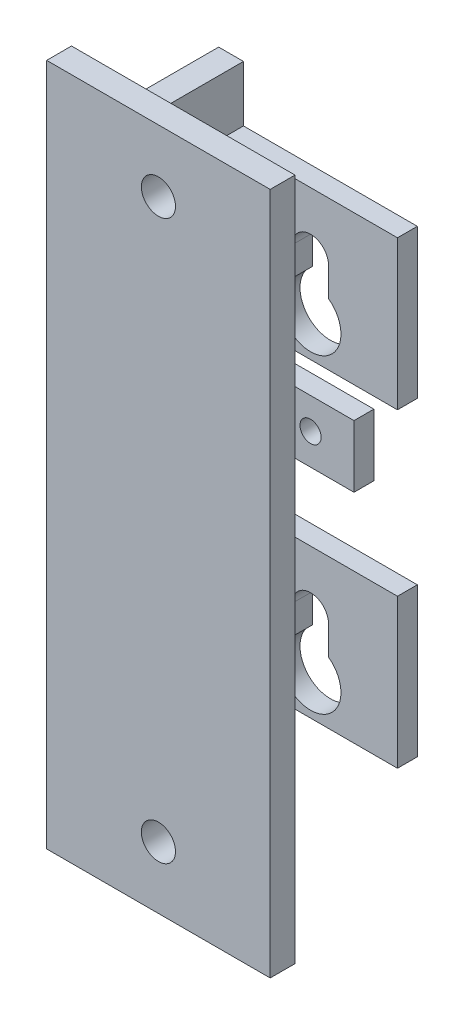
ISO-10303-21;
HEADER;
FILE_DESCRIPTION(('STEP AP214'),'2;1');
FILE_NAME('part.step','',(''),(''),'','','');
FILE_SCHEMA(('AUTOMOTIVE_DESIGN { 1 0 10303 214 1 1 1 1 }'));
ENDSEC;
DATA;
#1=APPLICATION_CONTEXT('core data for automotive mechanical design processes');
#2=APPLICATION_PROTOCOL_DEFINITION('international standard','automotive_design',2000,#1);
#3=PRODUCT_CONTEXT('',#1,'mechanical');
#4=PRODUCT('Part','Part','',(#3));
#5=PRODUCT_RELATED_PRODUCT_CATEGORY('part','',(#4));
#6=PRODUCT_DEFINITION_FORMATION('','',#4);
#7=PRODUCT_DEFINITION_CONTEXT('part definition',#1,'design');
#8=PRODUCT_DEFINITION('design','',#6,#7);
#9=PRODUCT_DEFINITION_SHAPE('','',#8);
#10=(LENGTH_UNIT() NAMED_UNIT(*) SI_UNIT(.MILLI.,.METRE.));
#11=(NAMED_UNIT(*) PLANE_ANGLE_UNIT() SI_UNIT($,.RADIAN.));
#12=(NAMED_UNIT(*) SI_UNIT($,.STERADIAN.) SOLID_ANGLE_UNIT());
#13=UNCERTAINTY_MEASURE_WITH_UNIT(LENGTH_MEASURE(1.E-05),#10,'distance_accuracy_value','');
#14=(GEOMETRIC_REPRESENTATION_CONTEXT(3) GLOBAL_UNCERTAINTY_ASSIGNED_CONTEXT((#13)) GLOBAL_UNIT_ASSIGNED_CONTEXT((#10,
#11,#12)) REPRESENTATION_CONTEXT('',''));
#15=CARTESIAN_POINT('',(0.,0.,0.));
#16=DIRECTION('',(0.,0.,1.));
#17=DIRECTION('',(1.,0.,0.));
#18=AXIS2_PLACEMENT_3D('',#15,#16,#17);
#19=CARTESIAN_POINT('',(-34.,-43.,68.3));
#20=DIRECTION('',(-1.,0.,0.));
#21=DIRECTION('',(0.,0.,1.));
#22=AXIS2_PLACEMENT_3D('',#19,#20,#21);
#23=PLANE('',#22);
#24=DIRECTION('',(0.,0.,-1.));
#25=VECTOR('',#24,1.);
#26=CARTESIAN_POINT('',(-34.,-5.,68.3));
#27=LINE('',#26,#25);
#28=CARTESIAN_POINT('',(-34.,-5.,47.5));
#29=VERTEX_POINT('',#28);
#30=CARTESIAN_POINT('',(-34.,-5.,44.3));
#31=VERTEX_POINT('',#30);
#32=EDGE_CURVE('E63',#29,#31,#27,.T.);
#33=ORIENTED_EDGE('',*,*,#32,.F.);
#34=DIRECTION('',(0.,1.,0.));
#35=VECTOR('',#34,1.);
#36=CARTESIAN_POINT('',(-34.,-43.,47.5));
#37=LINE('',#36,#35);
#38=CARTESIAN_POINT('',(-34.,5.,47.5));
#39=VERTEX_POINT('',#38);
#40=EDGE_CURVE('E58',#29,#39,#37,.T.);
#41=ORIENTED_EDGE('',*,*,#40,.T.);
#42=DIRECTION('',(0.,0.,1.));
#43=VECTOR('',#42,1.);
#44=CARTESIAN_POINT('',(-34.,5.,68.3));
#45=LINE('',#44,#43);
#46=CARTESIAN_POINT('',(-34.,5.,44.3));
#47=VERTEX_POINT('',#46);
#48=EDGE_CURVE('E261',#47,#39,#45,.T.);
#49=ORIENTED_EDGE('',*,*,#48,.F.);
#50=DIRECTION('',(0.,1.,0.));
#51=VECTOR('',#50,1.);
#52=CARTESIAN_POINT('',(-34.,-43.,44.3));
#53=LINE('',#52,#51);
#54=CARTESIAN_POINT('',(-34.,10.,44.3));
#55=VERTEX_POINT('',#54);
#56=EDGE_CURVE('E386',#47,#55,#53,.T.);
#57=ORIENTED_EDGE('',*,*,#56,.T.);
#58=DIRECTION('',(0.,0.,-1.));
#59=VECTOR('',#58,1.);
#60=CARTESIAN_POINT('',(-34.,10.,68.3));
#61=LINE('',#60,#59);
#62=CARTESIAN_POINT('',(-34.,10.,47.5));
#63=VERTEX_POINT('',#62);
#64=EDGE_CURVE('E345',#63,#55,#61,.T.);
#65=ORIENTED_EDGE('',*,*,#64,.F.);
#66=DIRECTION('',(0.,1.,0.));
#67=VECTOR('',#66,1.);
#68=CARTESIAN_POINT('',(-34.,-43.,47.5));
#69=LINE('',#68,#67);
#70=CARTESIAN_POINT('',(-34.,34.,47.5));
#71=VERTEX_POINT('',#70);
#72=EDGE_CURVE('E348',#63,#71,#69,.T.);
#73=ORIENTED_EDGE('',*,*,#72,.T.);
#74=DIRECTION('',(0.,0.,1.));
#75=VECTOR('',#74,1.);
#76=CARTESIAN_POINT('',(-34.,34.,68.3));
#77=LINE('',#76,#75);
#78=CARTESIAN_POINT('',(-34.,34.,44.3));
#79=VERTEX_POINT('',#78);
#80=EDGE_CURVE('E337',#79,#71,#77,.T.);
#81=ORIENTED_EDGE('',*,*,#80,.F.);
#82=CARTESIAN_POINT('',(-34.,43.,44.3));
#83=VERTEX_POINT('',#82);
#84=EDGE_CURVE('E381',#79,#83,#53,.T.);
#85=ORIENTED_EDGE('',*,*,#84,.T.);
#86=DIRECTION('',(0.,0.,-1.));
#87=VECTOR('',#86,1.);
#88=CARTESIAN_POINT('',(-34.,43.,68.3));
#89=LINE('',#88,#87);
#90=CARTESIAN_POINT('',(-34.,43.,68.));
#91=VERTEX_POINT('',#90);
#92=EDGE_CURVE('E391',#91,#83,#89,.T.);
#93=ORIENTED_EDGE('',*,*,#92,.F.);
#94=DIRECTION('',(0.,-1.,0.));
#95=VECTOR('',#94,1.);
#96=CARTESIAN_POINT('',(-34.,0.,68.));
#97=LINE('',#96,#95);
#98=CARTESIAN_POINT('',(-34.,-43.,68.));
#99=VERTEX_POINT('',#98);
#100=EDGE_CURVE('E433',#91,#99,#97,.T.);
#101=ORIENTED_EDGE('',*,*,#100,.T.);
#102=DIRECTION('',(0.,0.,-1.));
#103=VECTOR('',#102,1.);
#104=CARTESIAN_POINT('',(-34.,-43.,68.3));
#105=LINE('',#104,#103);
#106=CARTESIAN_POINT('',(-34.,-43.,44.3));
#107=VERTEX_POINT('',#106);
#108=EDGE_CURVE('E394',#99,#107,#105,.T.);
#109=ORIENTED_EDGE('',*,*,#108,.T.);
#110=CARTESIAN_POINT('',(-34.,-40.,44.3));
#111=VERTEX_POINT('',#110);
#112=EDGE_CURVE('E382',#107,#111,#53,.T.);
#113=ORIENTED_EDGE('',*,*,#112,.T.);
#114=DIRECTION('',(0.,0.,-1.));
#115=VECTOR('',#114,1.);
#116=CARTESIAN_POINT('',(-34.,-40.,68.3));
#117=LINE('',#116,#115);
#118=CARTESIAN_POINT('',(-34.,-40.,47.5));
#119=VERTEX_POINT('',#118);
#120=EDGE_CURVE('E373',#119,#111,#117,.T.);
#121=ORIENTED_EDGE('',*,*,#120,.F.);
#122=DIRECTION('',(0.,1.,0.));
#123=VECTOR('',#122,1.);
#124=CARTESIAN_POINT('',(-34.,-43.,47.5));
#125=LINE('',#124,#123);
#126=CARTESIAN_POINT('',(-34.,-16.,47.5));
#127=VERTEX_POINT('',#126);
#128=EDGE_CURVE('E439',#119,#127,#125,.T.);
#129=ORIENTED_EDGE('',*,*,#128,.T.);
#130=DIRECTION('',(0.,0.,1.));
#131=VECTOR('',#130,1.);
#132=CARTESIAN_POINT('',(-34.,-16.,68.3));
#133=LINE('',#132,#131);
#134=CARTESIAN_POINT('',(-34.,-16.,44.3));
#135=VERTEX_POINT('',#134);
#136=EDGE_CURVE('E370',#135,#127,#133,.T.);
#137=ORIENTED_EDGE('',*,*,#136,.F.);
#138=EDGE_CURVE('E385',#135,#31,#53,.T.);
#139=ORIENTED_EDGE('',*,*,#138,.T.);
#140=EDGE_LOOP('',(#33,#41,#49,#57,#65,#73,#81,#85,#93,#101,#109,#113,#121,#129,#137,#139));
#141=FACE_BOUND('',#140,.T.);
#142=ADVANCED_FACE('F41',(#141),#23,.F.);
#143=CARTESIAN_POINT('',(0.,0.,44.3));
#144=DIRECTION('',(0.,0.,1.));
#145=DIRECTION('',(1.,0.,0.));
#146=AXIS2_PLACEMENT_3D('',#143,#144,#145);
#147=PLANE('',#146);
#148=CARTESIAN_POINT('',(-20.,0.,44.3));
#149=DIRECTION('',(0.,0.,1.));
#150=DIRECTION('',(1.,0.,0.));
#151=AXIS2_PLACEMENT_3D('',#148,#149,#150);
#152=CIRCLE('',#151,1.7);
#153=CARTESIAN_POINT('',(-18.3,0.,44.3));
#154=VERTEX_POINT('',#153);
#155=EDGE_CURVE('E255',#154,#154,#152,.F.);
#156=ORIENTED_EDGE('',*,*,#155,.F.);
#157=EDGE_LOOP('',(#156));
#158=FACE_BOUND('',#157,.T.);
#159=DIRECTION('',(1.,0.,0.));
#160=VECTOR('',#159,1.);
#161=CARTESIAN_POINT('',(-38.,-43.,44.3));
#162=LINE('',#161,#160);
#163=CARTESIAN_POINT('',(-38.,-43.,44.3));
#164=VERTEX_POINT('',#163);
#165=EDGE_CURVE('E378',#164,#107,#162,.T.);
#166=ORIENTED_EDGE('',*,*,#165,.F.);
#167=DIRECTION('',(0.,-1.,0.));
#168=VECTOR('',#167,1.);
#169=CARTESIAN_POINT('',(-38.,43.,44.3));
#170=LINE('',#169,#168);
#171=CARTESIAN_POINT('',(-38.,43.,44.3));
#172=VERTEX_POINT('',#171);
#173=EDGE_CURVE('E376',#172,#164,#170,.T.);
#174=ORIENTED_EDGE('',*,*,#173,.F.);
#175=DIRECTION('',(-1.,0.,0.));
#176=VECTOR('',#175,1.);
#177=CARTESIAN_POINT('',(-34.,43.,44.3));
#178=LINE('',#177,#176);
#179=EDGE_CURVE('E384',#83,#172,#178,.T.);
#180=ORIENTED_EDGE('',*,*,#179,.F.);
#181=ORIENTED_EDGE('',*,*,#84,.F.);
#182=DIRECTION('',(-1.,0.,0.));
#183=VECTOR('',#182,1.);
#184=CARTESIAN_POINT('',(-6.,34.,44.3));
#185=LINE('',#184,#183);
#186=CARTESIAN_POINT('',(-6.,34.,44.3));
#187=VERTEX_POINT('',#186);
#188=EDGE_CURVE('E329',#187,#79,#185,.T.);
#189=ORIENTED_EDGE('',*,*,#188,.F.);
#190=DIRECTION('',(0.,1.,0.));
#191=VECTOR('',#190,1.);
#192=CARTESIAN_POINT('',(-6.,10.,44.3));
#193=LINE('',#192,#191);
#194=CARTESIAN_POINT('',(-6.,10.,44.3));
#195=VERTEX_POINT('',#194);
#196=EDGE_CURVE('E332',#195,#187,#193,.T.);
#197=ORIENTED_EDGE('',*,*,#196,.F.);
#198=DIRECTION('',(1.,0.,0.));
#199=VECTOR('',#198,1.);
#200=CARTESIAN_POINT('',(-38.,10.,44.3));
#201=LINE('',#200,#199);
#202=EDGE_CURVE('E335',#55,#195,#201,.T.);
#203=ORIENTED_EDGE('',*,*,#202,.F.);
#204=ORIENTED_EDGE('',*,*,#56,.F.);
#205=DIRECTION('',(-1.,0.,0.));
#206=VECTOR('',#205,1.);
#207=CARTESIAN_POINT('',(-13.,5.,44.3));
#208=LINE('',#207,#206);
#209=CARTESIAN_POINT('',(-13.,5.,44.3));
#210=VERTEX_POINT('',#209);
#211=EDGE_CURVE('E234',#210,#47,#208,.T.);
#212=ORIENTED_EDGE('',*,*,#211,.F.);
#213=DIRECTION('',(0.,1.,0.));
#214=VECTOR('',#213,1.);
#215=CARTESIAN_POINT('',(-13.,-5.,44.3));
#216=LINE('',#215,#214);
#217=CARTESIAN_POINT('',(-13.,-5.,44.3));
#218=VERTEX_POINT('',#217);
#219=EDGE_CURVE('E254',#218,#210,#216,.T.);
#220=ORIENTED_EDGE('',*,*,#219,.F.);
#221=DIRECTION('',(1.,0.,0.));
#222=VECTOR('',#221,1.);
#223=CARTESIAN_POINT('',(-38.,-5.,44.3));
#224=LINE('',#223,#222);
#225=EDGE_CURVE('E240',#31,#218,#224,.T.);
#226=ORIENTED_EDGE('',*,*,#225,.F.);
#227=ORIENTED_EDGE('',*,*,#138,.F.);
#228=DIRECTION('',(-1.,0.,0.));
#229=VECTOR('',#228,1.);
#230=CARTESIAN_POINT('',(-6.,-16.,44.3));
#231=LINE('',#230,#229);
#232=CARTESIAN_POINT('',(-6.,-16.,44.3));
#233=VERTEX_POINT('',#232);
#234=EDGE_CURVE('E354',#233,#135,#231,.T.);
#235=ORIENTED_EDGE('',*,*,#234,.F.);
#236=DIRECTION('',(0.,1.,0.));
#237=VECTOR('',#236,1.);
#238=CARTESIAN_POINT('',(-6.,-40.,44.3));
#239=LINE('',#238,#237);
#240=CARTESIAN_POINT('',(-6.,-40.,44.3));
#241=VERTEX_POINT('',#240);
#242=EDGE_CURVE('E361',#241,#233,#239,.T.);
#243=ORIENTED_EDGE('',*,*,#242,.F.);
#244=DIRECTION('',(1.,0.,0.));
#245=VECTOR('',#244,1.);
#246=CARTESIAN_POINT('',(-38.,-40.,44.3));
#247=LINE('',#246,#245);
#248=EDGE_CURVE('E350',#111,#241,#247,.T.);
#249=ORIENTED_EDGE('',*,*,#248,.F.);
#250=ORIENTED_EDGE('',*,*,#112,.F.);
#251=EDGE_LOOP('',(#166,#174,#180,#181,#189,#197,#203,#204,#212,#220,#226,#227,#235,#243,#249,#250));
#252=FACE_BOUND('',#251,.T.);
#253=CARTESIAN_POINT('',(-20.,24.6,44.3));
#254=DIRECTION('',(0.,0.,1.));
#255=DIRECTION('',(1.,0.,0.));
#256=AXIS2_PLACEMENT_3D('',#253,#254,#255);
#257=CIRCLE('',#256,2.9);
#258=CARTESIAN_POINT('',(-22.9,24.6,44.3));
#259=VERTEX_POINT('',#258);
#260=CARTESIAN_POINT('',(-17.1,24.6,44.3));
#261=VERTEX_POINT('',#260);
#262=EDGE_CURVE('E275',#259,#261,#257,.F.);
#263=ORIENTED_EDGE('',*,*,#262,.F.);
#264=DIRECTION('',(0.,1.,0.));
#265=VECTOR('',#264,1.);
#266=CARTESIAN_POINT('',(-22.9,0.,44.3));
#267=LINE('',#266,#265);
#268=CARTESIAN_POINT('',(-22.9,19.9496835316263,44.3));
#269=VERTEX_POINT('',#268);
#270=EDGE_CURVE('E311',#269,#259,#267,.T.);
#271=ORIENTED_EDGE('',*,*,#270,.F.);
#272=CARTESIAN_POINT('',(-20.,16.,44.3));
#273=DIRECTION('',(0.,0.,1.));
#274=DIRECTION('',(1.,0.,0.));
#275=AXIS2_PLACEMENT_3D('',#272,#273,#274);
#276=CIRCLE('',#275,4.9);
#277=CARTESIAN_POINT('',(-17.1,19.9496835316263,44.3));
#278=VERTEX_POINT('',#277);
#279=EDGE_CURVE('E315',#278,#269,#276,.F.);
#280=ORIENTED_EDGE('',*,*,#279,.F.);
#281=DIRECTION('',(0.,-1.,0.));
#282=VECTOR('',#281,1.);
#283=CARTESIAN_POINT('',(-17.1,0.,44.3));
#284=LINE('',#283,#282);
#285=EDGE_CURVE('E306',#261,#278,#284,.T.);
#286=ORIENTED_EDGE('',*,*,#285,.F.);
#287=EDGE_LOOP('',(#263,#271,#280,#286));
#288=FACE_BOUND('',#287,.T.);
#289=CARTESIAN_POINT('',(-20.,-25.4,44.3));
#290=DIRECTION('',(0.,0.,1.));
#291=DIRECTION('',(1.,0.,0.));
#292=AXIS2_PLACEMENT_3D('',#289,#290,#291);
#293=CIRCLE('',#292,2.9);
#294=CARTESIAN_POINT('',(-22.9,-25.4,44.3));
#295=VERTEX_POINT('',#294);
#296=CARTESIAN_POINT('',(-17.1,-25.4,44.3));
#297=VERTEX_POINT('',#296);
#298=EDGE_CURVE('E280',#295,#297,#293,.F.);
#299=ORIENTED_EDGE('',*,*,#298,.F.);
#300=DIRECTION('',(0.,1.,0.));
#301=VECTOR('',#300,1.);
#302=CARTESIAN_POINT('',(-22.9,0.,44.3));
#303=LINE('',#302,#301);
#304=CARTESIAN_POINT('',(-22.9,-30.0503164683737,44.3));
#305=VERTEX_POINT('',#304);
#306=EDGE_CURVE('E300',#305,#295,#303,.T.);
#307=ORIENTED_EDGE('',*,*,#306,.F.);
#308=CARTESIAN_POINT('',(-20.,-34.,44.3));
#309=DIRECTION('',(0.,0.,1.));
#310=DIRECTION('',(1.,0.,0.));
#311=AXIS2_PLACEMENT_3D('',#308,#309,#310);
#312=CIRCLE('',#311,4.9);
#313=CARTESIAN_POINT('',(-17.1,-30.0503164683737,44.3));
#314=VERTEX_POINT('',#313);
#315=EDGE_CURVE('E319',#314,#305,#312,.F.);
#316=ORIENTED_EDGE('',*,*,#315,.F.);
#317=DIRECTION('',(0.,-1.,0.));
#318=VECTOR('',#317,1.);
#319=CARTESIAN_POINT('',(-17.1,0.,44.3));
#320=LINE('',#319,#318);
#321=EDGE_CURVE('E295',#297,#314,#320,.T.);
#322=ORIENTED_EDGE('',*,*,#321,.F.);
#323=EDGE_LOOP('',(#299,#307,#316,#322));
#324=FACE_BOUND('',#323,.T.);
#325=ADVANCED_FACE('F485',(#158,#252,#288,#324),#147,.F.);
#326=CARTESIAN_POINT('',(0.,0.,47.5));
#327=DIRECTION('',(0.,0.,1.));
#328=DIRECTION('',(1.,0.,0.));
#329=AXIS2_PLACEMENT_3D('',#326,#327,#328);
#330=PLANE('',#329);
#331=ORIENTED_EDGE('',*,*,#128,.F.);
#332=DIRECTION('',(1.,0.,0.));
#333=VECTOR('',#332,1.);
#334=CARTESIAN_POINT('',(-38.,-40.,47.5));
#335=LINE('',#334,#333);
#336=CARTESIAN_POINT('',(-6.,-40.,47.5));
#337=VERTEX_POINT('',#336);
#338=EDGE_CURVE('E351',#119,#337,#335,.T.);
#339=ORIENTED_EDGE('',*,*,#338,.T.);
#340=DIRECTION('',(0.,1.,0.));
#341=VECTOR('',#340,1.);
#342=CARTESIAN_POINT('',(-6.,-40.,47.5));
#343=LINE('',#342,#341);
#344=CARTESIAN_POINT('',(-6.,-16.,47.5));
#345=VERTEX_POINT('',#344);
#346=EDGE_CURVE('E353',#337,#345,#343,.T.);
#347=ORIENTED_EDGE('',*,*,#346,.T.);
#348=DIRECTION('',(-1.,0.,0.));
#349=VECTOR('',#348,1.);
#350=CARTESIAN_POINT('',(-6.,-16.,47.5));
#351=LINE('',#350,#349);
#352=EDGE_CURVE('E356',#345,#127,#351,.T.);
#353=ORIENTED_EDGE('',*,*,#352,.T.);
#354=EDGE_LOOP('',(#331,#339,#347,#353));
#355=FACE_BOUND('',#354,.T.);
#356=DIRECTION('',(0.,1.,0.));
#357=VECTOR('',#356,1.);
#358=CARTESIAN_POINT('',(-22.9,0.,47.5));
#359=LINE('',#358,#357);
#360=CARTESIAN_POINT('',(-22.9,-30.0503164683737,47.5));
#361=VERTEX_POINT('',#360);
#362=CARTESIAN_POINT('',(-22.9,-25.4,47.5));
#363=VERTEX_POINT('',#362);
#364=EDGE_CURVE('E297',#361,#363,#359,.T.);
#365=ORIENTED_EDGE('',*,*,#364,.T.);
#366=CARTESIAN_POINT('',(-20.,-25.4,47.5));
#367=DIRECTION('',(0.,0.,1.));
#368=DIRECTION('',(1.,0.,0.));
#369=AXIS2_PLACEMENT_3D('',#366,#367,#368);
#370=CIRCLE('',#369,2.9);
#371=CARTESIAN_POINT('',(-17.1,-25.4,47.5));
#372=VERTEX_POINT('',#371);
#373=EDGE_CURVE('E277',#363,#372,#370,.F.);
#374=ORIENTED_EDGE('',*,*,#373,.T.);
#375=DIRECTION('',(0.,-1.,0.));
#376=VECTOR('',#375,1.);
#377=CARTESIAN_POINT('',(-17.1,0.,47.5));
#378=LINE('',#377,#376);
#379=CARTESIAN_POINT('',(-17.1,-30.0503164683737,47.5));
#380=VERTEX_POINT('',#379);
#381=EDGE_CURVE('E289',#372,#380,#378,.T.);
#382=ORIENTED_EDGE('',*,*,#381,.T.);
#383=CARTESIAN_POINT('',(-20.,-34.,47.5));
#384=DIRECTION('',(0.,0.,1.));
#385=DIRECTION('',(1.,0.,0.));
#386=AXIS2_PLACEMENT_3D('',#383,#384,#385);
#387=CIRCLE('',#386,4.9);
#388=EDGE_CURVE('E318',#380,#361,#387,.F.);
#389=ORIENTED_EDGE('',*,*,#388,.T.);
#390=EDGE_LOOP('',(#365,#374,#382,#389));
#391=FACE_BOUND('',#390,.T.);
#392=ADVANCED_FACE('F495',(#355,#391),#330,.T.);
#393=CARTESIAN_POINT('',(0.,0.,47.5));
#394=DIRECTION('',(0.,0.,1.));
#395=DIRECTION('',(1.,0.,0.));
#396=AXIS2_PLACEMENT_3D('',#393,#394,#395);
#397=PLANE('',#396);
#398=ORIENTED_EDGE('',*,*,#72,.F.);
#399=DIRECTION('',(1.,0.,0.));
#400=VECTOR('',#399,1.);
#401=CARTESIAN_POINT('',(-38.,10.,47.5));
#402=LINE('',#401,#400);
#403=CARTESIAN_POINT('',(-6.,10.,47.5));
#404=VERTEX_POINT('',#403);
#405=EDGE_CURVE('E333',#63,#404,#402,.T.);
#406=ORIENTED_EDGE('',*,*,#405,.T.);
#407=DIRECTION('',(0.,1.,0.));
#408=VECTOR('',#407,1.);
#409=CARTESIAN_POINT('',(-6.,10.,47.5));
#410=LINE('',#409,#408);
#411=CARTESIAN_POINT('',(-6.,34.,47.5));
#412=VERTEX_POINT('',#411);
#413=EDGE_CURVE('E340',#404,#412,#410,.T.);
#414=ORIENTED_EDGE('',*,*,#413,.T.);
#415=DIRECTION('',(-1.,0.,0.));
#416=VECTOR('',#415,1.);
#417=CARTESIAN_POINT('',(-6.,34.,47.5));
#418=LINE('',#417,#416);
#419=EDGE_CURVE('E328',#412,#71,#418,.T.);
#420=ORIENTED_EDGE('',*,*,#419,.T.);
#421=EDGE_LOOP('',(#398,#406,#414,#420));
#422=FACE_BOUND('',#421,.T.);
#423=DIRECTION('',(0.,1.,0.));
#424=VECTOR('',#423,1.);
#425=CARTESIAN_POINT('',(-22.9,0.,47.5));
#426=LINE('',#425,#424);
#427=CARTESIAN_POINT('',(-22.9,19.9496835316263,47.5));
#428=VERTEX_POINT('',#427);
#429=CARTESIAN_POINT('',(-22.9,24.6,47.5));
#430=VERTEX_POINT('',#429);
#431=EDGE_CURVE('E308',#428,#430,#426,.T.);
#432=ORIENTED_EDGE('',*,*,#431,.T.);
#433=CARTESIAN_POINT('',(-20.,24.6,47.5));
#434=DIRECTION('',(0.,0.,1.));
#435=DIRECTION('',(1.,0.,0.));
#436=AXIS2_PLACEMENT_3D('',#433,#434,#435);
#437=CIRCLE('',#436,2.9);
#438=CARTESIAN_POINT('',(-17.1,24.6,47.5));
#439=VERTEX_POINT('',#438);
#440=EDGE_CURVE('E272',#430,#439,#437,.F.);
#441=ORIENTED_EDGE('',*,*,#440,.T.);
#442=DIRECTION('',(0.,-1.,0.));
#443=VECTOR('',#442,1.);
#444=CARTESIAN_POINT('',(-17.1,0.,47.5));
#445=LINE('',#444,#443);
#446=CARTESIAN_POINT('',(-17.1,19.9496835316263,47.5));
#447=VERTEX_POINT('',#446);
#448=EDGE_CURVE('E303',#439,#447,#445,.T.);
#449=ORIENTED_EDGE('',*,*,#448,.T.);
#450=CARTESIAN_POINT('',(-20.,16.,47.5));
#451=DIRECTION('',(0.,0.,1.));
#452=DIRECTION('',(1.,0.,0.));
#453=AXIS2_PLACEMENT_3D('',#450,#451,#452);
#454=CIRCLE('',#453,4.9);
#455=EDGE_CURVE('E314',#447,#428,#454,.F.);
#456=ORIENTED_EDGE('',*,*,#455,.T.);
#457=EDGE_LOOP('',(#432,#441,#449,#456));
#458=FACE_BOUND('',#457,.T.);
#459=ADVANCED_FACE('F556',(#422,#458),#397,.T.);
#460=CARTESIAN_POINT('',(-20.,16.,52.));
#461=DIRECTION('',(0.,0.,-1.));
#462=DIRECTION('',(-1.,0.,0.));
#463=AXIS2_PLACEMENT_3D('',#460,#461,#462);
#464=CYLINDRICAL_SURFACE('',#463,4.9);
#465=ORIENTED_EDGE('',*,*,#279,.T.);
#466=DIRECTION('',(0.,0.,-1.));
#467=VECTOR('',#466,1.);
#468=CARTESIAN_POINT('',(-22.9,19.9496835316263,52.));
#469=LINE('',#468,#467);
#470=EDGE_CURVE('E11',#269,#428,#469,.F.);
#471=ORIENTED_EDGE('',*,*,#470,.T.);
#472=ORIENTED_EDGE('',*,*,#455,.F.);
#473=DIRECTION('',(0.,0.,-1.));
#474=VECTOR('',#473,1.);
#475=CARTESIAN_POINT('',(-17.1,19.9496835316263,52.));
#476=LINE('',#475,#474);
#477=EDGE_CURVE('E50',#447,#278,#476,.T.);
#478=ORIENTED_EDGE('',*,*,#477,.T.);
#479=EDGE_LOOP('',(#465,#471,#472,#478));
#480=FACE_BOUND('',#479,.T.);
#481=ADVANCED_FACE('F559',(#480),#464,.F.);
#482=CARTESIAN_POINT('',(-20.,-34.,52.));
#483=DIRECTION('',(0.,0.,-1.));
#484=DIRECTION('',(-1.,0.,0.));
#485=AXIS2_PLACEMENT_3D('',#482,#483,#484);
#486=CYLINDRICAL_SURFACE('',#485,4.9);
#487=ORIENTED_EDGE('',*,*,#315,.T.);
#488=DIRECTION('',(0.,0.,-1.));
#489=VECTOR('',#488,1.);
#490=CARTESIAN_POINT('',(-22.9,-30.0503164683737,52.));
#491=LINE('',#490,#489);
#492=EDGE_CURVE('E448',#305,#361,#491,.F.);
#493=ORIENTED_EDGE('',*,*,#492,.T.);
#494=ORIENTED_EDGE('',*,*,#388,.F.);
#495=DIRECTION('',(0.,0.,-1.));
#496=VECTOR('',#495,1.);
#497=CARTESIAN_POINT('',(-17.1,-30.0503164683737,52.));
#498=LINE('',#497,#496);
#499=EDGE_CURVE('E441',#380,#314,#498,.T.);
#500=ORIENTED_EDGE('',*,*,#499,.T.);
#501=EDGE_LOOP('',(#487,#493,#494,#500));
#502=FACE_BOUND('',#501,.T.);
#503=ADVANCED_FACE('F470',(#502),#486,.F.);
#504=CARTESIAN_POINT('',(0.,0.,68.));
#505=DIRECTION('',(0.,0.,1.));
#506=DIRECTION('',(1.,0.,0.));
#507=AXIS2_PLACEMENT_3D('',#504,#505,#506);
#508=PLANE('',#507);
#509=CARTESIAN_POINT('',(-20.,-45.,68.));
#510=DIRECTION('',(0.,0.,1.));
#511=DIRECTION('',(1.,0.,0.));
#512=AXIS2_PLACEMENT_3D('',#509,#510,#511);
#513=CIRCLE('',#512,2.75);
#514=CARTESIAN_POINT('',(-17.25,-45.,68.));
#515=VERTEX_POINT('',#514);
#516=EDGE_CURVE('E269',#515,#515,#513,.F.);
#517=ORIENTED_EDGE('',*,*,#516,.F.);
#518=EDGE_LOOP('',(#517));
#519=FACE_BOUND('',#518,.T.);
#520=CARTESIAN_POINT('',(-20.,45.,68.));
#521=DIRECTION('',(0.,0.,1.));
#522=DIRECTION('',(1.,0.,0.));
#523=AXIS2_PLACEMENT_3D('',#520,#521,#522);
#524=CIRCLE('',#523,2.75);
#525=CARTESIAN_POINT('',(-17.25,45.,68.));
#526=VERTEX_POINT('',#525);
#527=EDGE_CURVE('E265',#526,#526,#524,.F.);
#528=ORIENTED_EDGE('',*,*,#527,.F.);
#529=EDGE_LOOP('',(#528));
#530=FACE_BOUND('',#529,.T.);
#531=DIRECTION('',(-1.,0.,0.));
#532=VECTOR('',#531,1.);
#533=CARTESIAN_POINT('',(0.,-43.,68.));
#534=LINE('',#533,#532);
#535=CARTESIAN_POINT('',(-38.,-43.,68.));
#536=VERTEX_POINT('',#535);
#537=EDGE_CURVE('E436',#99,#536,#534,.T.);
#538=ORIENTED_EDGE('',*,*,#537,.F.);
#539=ORIENTED_EDGE('',*,*,#100,.F.);
#540=DIRECTION('',(1.,0.,0.));
#541=VECTOR('',#540,1.);
#542=CARTESIAN_POINT('',(0.,43.,68.));
#543=LINE('',#542,#541);
#544=CARTESIAN_POINT('',(-38.,43.,68.));
#545=VERTEX_POINT('',#544);
#546=EDGE_CURVE('E430',#545,#91,#543,.T.);
#547=ORIENTED_EDGE('',*,*,#546,.F.);
#548=DIRECTION('',(0.,-1.,0.));
#549=VECTOR('',#548,1.);
#550=CARTESIAN_POINT('',(-38.,55.,68.));
#551=LINE('',#550,#549);
#552=CARTESIAN_POINT('',(-38.,55.,68.));
#553=VERTEX_POINT('',#552);
#554=EDGE_CURVE('E411',#553,#545,#551,.T.);
#555=ORIENTED_EDGE('',*,*,#554,.F.);
#556=DIRECTION('',(-1.,0.,0.));
#557=VECTOR('',#556,1.);
#558=CARTESIAN_POINT('',(-2.,55.,68.));
#559=LINE('',#558,#557);
#560=CARTESIAN_POINT('',(-2.,55.,68.));
#561=VERTEX_POINT('',#560);
#562=EDGE_CURVE('E404',#561,#553,#559,.T.);
#563=ORIENTED_EDGE('',*,*,#562,.F.);
#564=DIRECTION('',(0.,1.,0.));
#565=VECTOR('',#564,1.);
#566=CARTESIAN_POINT('',(-2.,-55.,68.));
#567=LINE('',#566,#565);
#568=CARTESIAN_POINT('',(-2.,-55.,68.));
#569=VERTEX_POINT('',#568);
#570=EDGE_CURVE('E416',#569,#561,#567,.T.);
#571=ORIENTED_EDGE('',*,*,#570,.F.);
#572=DIRECTION('',(1.,0.,0.));
#573=VECTOR('',#572,1.);
#574=CARTESIAN_POINT('',(-38.,-55.,68.));
#575=LINE('',#574,#573);
#576=CARTESIAN_POINT('',(-38.,-55.,68.));
#577=VERTEX_POINT('',#576);
#578=EDGE_CURVE('E414',#577,#569,#575,.T.);
#579=ORIENTED_EDGE('',*,*,#578,.F.);
#580=EDGE_CURVE('E399',#536,#577,#551,.T.);
#581=ORIENTED_EDGE('',*,*,#580,.F.);
#582=EDGE_LOOP('',(#538,#539,#547,#555,#563,#571,#579,#581));
#583=FACE_BOUND('',#582,.T.);
#584=ADVANCED_FACE('F467',(#519,#530,#583),#508,.F.);
#585=CARTESIAN_POINT('',(-38.,55.,72.));
#586=DIRECTION('',(1.,0.,0.));
#587=DIRECTION('',(0.,0.,-1.));
#588=AXIS2_PLACEMENT_3D('',#585,#586,#587);
#589=PLANE('',#588);
#590=ORIENTED_EDGE('',*,*,#173,.T.);
#591=DIRECTION('',(0.,0.,-1.));
#592=VECTOR('',#591,1.);
#593=CARTESIAN_POINT('',(-38.,-43.,68.3));
#594=LINE('',#593,#592);
#595=EDGE_CURVE('E396',#536,#164,#594,.T.);
#596=ORIENTED_EDGE('',*,*,#595,.F.);
#597=ORIENTED_EDGE('',*,*,#580,.T.);
#598=DIRECTION('',(0.,0.,-1.));
#599=VECTOR('',#598,1.);
#600=CARTESIAN_POINT('',(-38.,-55.,72.));
#601=LINE('',#600,#599);
#602=CARTESIAN_POINT('',(-38.,-55.,72.));
#603=VERTEX_POINT('',#602);
#604=EDGE_CURVE('E427',#603,#577,#601,.T.);
#605=ORIENTED_EDGE('',*,*,#604,.F.);
#606=DIRECTION('',(0.,-1.,0.));
#607=VECTOR('',#606,1.);
#608=CARTESIAN_POINT('',(-38.,55.,72.));
#609=LINE('',#608,#607);
#610=CARTESIAN_POINT('',(-38.,55.,72.));
#611=VERTEX_POINT('',#610);
#612=EDGE_CURVE('E400',#611,#603,#609,.T.);
#613=ORIENTED_EDGE('',*,*,#612,.F.);
#614=DIRECTION('',(0.,0.,-1.));
#615=VECTOR('',#614,1.);
#616=CARTESIAN_POINT('',(-38.,55.,72.));
#617=LINE('',#616,#615);
#618=EDGE_CURVE('E410',#611,#553,#617,.T.);
#619=ORIENTED_EDGE('',*,*,#618,.T.);
#620=ORIENTED_EDGE('',*,*,#554,.T.);
#621=DIRECTION('',(0.,0.,-1.));
#622=VECTOR('',#621,1.);
#623=CARTESIAN_POINT('',(-38.,43.,68.3));
#624=LINE('',#623,#622);
#625=EDGE_CURVE('E389',#545,#172,#624,.T.);
#626=ORIENTED_EDGE('',*,*,#625,.T.);
#627=EDGE_LOOP('',(#590,#596,#597,#605,#613,#619,#620,#626));
#628=FACE_BOUND('',#627,.T.);
#629=ADVANCED_FACE('F43',(#628),#589,.F.);
#630=CARTESIAN_POINT('',(-38.,-55.,72.));
#631=DIRECTION('',(0.,1.,0.));
#632=DIRECTION('',(0.,0.,1.));
#633=AXIS2_PLACEMENT_3D('',#630,#631,#632);
#634=PLANE('',#633);
#635=ORIENTED_EDGE('',*,*,#578,.T.);
#636=DIRECTION('',(0.,0.,-1.));
#637=VECTOR('',#636,1.);
#638=CARTESIAN_POINT('',(-2.,-55.,72.));
#639=LINE('',#638,#637);
#640=CARTESIAN_POINT('',(-2.,-55.,72.));
#641=VERTEX_POINT('',#640);
#642=EDGE_CURVE('E424',#641,#569,#639,.T.);
#643=ORIENTED_EDGE('',*,*,#642,.F.);
#644=DIRECTION('',(1.,0.,0.));
#645=VECTOR('',#644,1.);
#646=CARTESIAN_POINT('',(-38.,-55.,72.));
#647=LINE('',#646,#645);
#648=EDGE_CURVE('E403',#603,#641,#647,.T.);
#649=ORIENTED_EDGE('',*,*,#648,.F.);
#650=ORIENTED_EDGE('',*,*,#604,.T.);
#651=EDGE_LOOP('',(#635,#643,#649,#650));
#652=FACE_BOUND('',#651,.T.);
#653=ADVANCED_FACE('F524',(#652),#634,.F.);
#654=CARTESIAN_POINT('',(-2.,-55.,72.));
#655=DIRECTION('',(-1.,0.,0.));
#656=DIRECTION('',(0.,0.,1.));
#657=AXIS2_PLACEMENT_3D('',#654,#655,#656);
#658=PLANE('',#657);
#659=ORIENTED_EDGE('',*,*,#570,.T.);
#660=DIRECTION('',(0.,0.,-1.));
#661=VECTOR('',#660,1.);
#662=CARTESIAN_POINT('',(-2.,55.,72.));
#663=LINE('',#662,#661);
#664=CARTESIAN_POINT('',(-2.,55.,72.));
#665=VERTEX_POINT('',#664);
#666=EDGE_CURVE('E421',#665,#561,#663,.T.);
#667=ORIENTED_EDGE('',*,*,#666,.F.);
#668=DIRECTION('',(0.,1.,0.));
#669=VECTOR('',#668,1.);
#670=CARTESIAN_POINT('',(-2.,-55.,72.));
#671=LINE('',#670,#669);
#672=EDGE_CURVE('E406',#641,#665,#671,.T.);
#673=ORIENTED_EDGE('',*,*,#672,.F.);
#674=ORIENTED_EDGE('',*,*,#642,.T.);
#675=EDGE_LOOP('',(#659,#667,#673,#674));
#676=FACE_BOUND('',#675,.T.);
#677=ADVANCED_FACE('F521',(#676),#658,.F.);
#678=CARTESIAN_POINT('',(-2.,55.,72.));
#679=DIRECTION('',(0.,-1.,0.));
#680=DIRECTION('',(0.,0.,-1.));
#681=AXIS2_PLACEMENT_3D('',#678,#679,#680);
#682=PLANE('',#681);
#683=ORIENTED_EDGE('',*,*,#562,.T.);
#684=ORIENTED_EDGE('',*,*,#618,.F.);
#685=DIRECTION('',(-1.,0.,0.));
#686=VECTOR('',#685,1.);
#687=CARTESIAN_POINT('',(-2.,55.,72.));
#688=LINE('',#687,#686);
#689=EDGE_CURVE('E408',#665,#611,#688,.T.);
#690=ORIENTED_EDGE('',*,*,#689,.F.);
#691=ORIENTED_EDGE('',*,*,#666,.T.);
#692=EDGE_LOOP('',(#683,#684,#690,#691));
#693=FACE_BOUND('',#692,.T.);
#694=ADVANCED_FACE('F516',(#693),#682,.F.);
#695=CARTESIAN_POINT('',(0.,0.,72.));
#696=DIRECTION('',(0.,0.,1.));
#697=DIRECTION('',(1.,0.,0.));
#698=AXIS2_PLACEMENT_3D('',#695,#696,#697);
#699=PLANE('',#698);
#700=CARTESIAN_POINT('',(-20.,-45.,72.));
#701=DIRECTION('',(0.,0.,1.));
#702=DIRECTION('',(1.,0.,0.));
#703=AXIS2_PLACEMENT_3D('',#700,#701,#702);
#704=CIRCLE('',#703,2.75);
#705=CARTESIAN_POINT('',(-17.25,-45.,72.));
#706=VERTEX_POINT('',#705);
#707=EDGE_CURVE('E268',#706,#706,#704,.F.);
#708=ORIENTED_EDGE('',*,*,#707,.T.);
#709=EDGE_LOOP('',(#708));
#710=FACE_BOUND('',#709,.T.);
#711=CARTESIAN_POINT('',(-20.,45.,72.));
#712=DIRECTION('',(0.,0.,1.));
#713=DIRECTION('',(1.,0.,0.));
#714=AXIS2_PLACEMENT_3D('',#711,#712,#713);
#715=CIRCLE('',#714,2.75);
#716=CARTESIAN_POINT('',(-17.25,45.,72.));
#717=VERTEX_POINT('',#716);
#718=EDGE_CURVE('E264',#717,#717,#715,.F.);
#719=ORIENTED_EDGE('',*,*,#718,.T.);
#720=EDGE_LOOP('',(#719));
#721=FACE_BOUND('',#720,.T.);
#722=ORIENTED_EDGE('',*,*,#612,.T.);
#723=ORIENTED_EDGE('',*,*,#648,.T.);
#724=ORIENTED_EDGE('',*,*,#672,.T.);
#725=ORIENTED_EDGE('',*,*,#689,.T.);
#726=EDGE_LOOP('',(#722,#723,#724,#725));
#727=FACE_BOUND('',#726,.T.);
#728=ADVANCED_FACE('F457',(#710,#721,#727),#699,.T.);
#729=CARTESIAN_POINT('',(-38.,-43.,68.3));
#730=DIRECTION('',(0.,1.,0.));
#731=DIRECTION('',(0.,0.,1.));
#732=AXIS2_PLACEMENT_3D('',#729,#730,#731);
#733=PLANE('',#732);
#734=ORIENTED_EDGE('',*,*,#108,.F.);
#735=ORIENTED_EDGE('',*,*,#537,.T.);
#736=ORIENTED_EDGE('',*,*,#595,.T.);
#737=ORIENTED_EDGE('',*,*,#165,.T.);
#738=EDGE_LOOP('',(#734,#735,#736,#737));
#739=FACE_BOUND('',#738,.T.);
#740=ADVANCED_FACE('F479',(#739),#733,.F.);
#741=CARTESIAN_POINT('',(-34.,43.,68.3));
#742=DIRECTION('',(0.,-1.,0.));
#743=DIRECTION('',(0.,0.,-1.));
#744=AXIS2_PLACEMENT_3D('',#741,#742,#743);
#745=PLANE('',#744);
#746=ORIENTED_EDGE('',*,*,#625,.F.);
#747=ORIENTED_EDGE('',*,*,#546,.T.);
#748=ORIENTED_EDGE('',*,*,#92,.T.);
#749=ORIENTED_EDGE('',*,*,#179,.T.);
#750=EDGE_LOOP('',(#746,#747,#748,#749));
#751=FACE_BOUND('',#750,.T.);
#752=ADVANCED_FACE('F508',(#751),#745,.F.);
#753=CARTESIAN_POINT('',(-38.,-40.,47.5));
#754=DIRECTION('',(0.,1.,0.));
#755=DIRECTION('',(0.,0.,1.));
#756=AXIS2_PLACEMENT_3D('',#753,#754,#755);
#757=PLANE('',#756);
#758=ORIENTED_EDGE('',*,*,#338,.F.);
#759=ORIENTED_EDGE('',*,*,#120,.T.);
#760=ORIENTED_EDGE('',*,*,#248,.T.);
#761=DIRECTION('',(0.,0.,-1.));
#762=VECTOR('',#761,1.);
#763=CARTESIAN_POINT('',(-6.,-40.,47.5));
#764=LINE('',#763,#762);
#765=EDGE_CURVE('E367',#337,#241,#764,.T.);
#766=ORIENTED_EDGE('',*,*,#765,.F.);
#767=EDGE_LOOP('',(#758,#759,#760,#766));
#768=FACE_BOUND('',#767,.T.);
#769=ADVANCED_FACE('F491',(#768),#757,.F.);
#770=CARTESIAN_POINT('',(-6.,-16.,47.5));
#771=DIRECTION('',(0.,-1.,0.));
#772=DIRECTION('',(0.,0.,-1.));
#773=AXIS2_PLACEMENT_3D('',#770,#771,#772);
#774=PLANE('',#773);
#775=ORIENTED_EDGE('',*,*,#234,.T.);
#776=ORIENTED_EDGE('',*,*,#136,.T.);
#777=ORIENTED_EDGE('',*,*,#352,.F.);
#778=DIRECTION('',(0.,0.,-1.));
#779=VECTOR('',#778,1.);
#780=CARTESIAN_POINT('',(-6.,-16.,47.5));
#781=LINE('',#780,#779);
#782=EDGE_CURVE('E359',#345,#233,#781,.T.);
#783=ORIENTED_EDGE('',*,*,#782,.T.);
#784=EDGE_LOOP('',(#775,#776,#777,#783));
#785=FACE_BOUND('',#784,.T.);
#786=ADVANCED_FACE('F501',(#785),#774,.F.);
#787=CARTESIAN_POINT('',(-6.,-40.,47.5));
#788=DIRECTION('',(-1.,0.,0.));
#789=DIRECTION('',(0.,0.,1.));
#790=AXIS2_PLACEMENT_3D('',#787,#788,#789);
#791=PLANE('',#790);
#792=ORIENTED_EDGE('',*,*,#242,.T.);
#793=ORIENTED_EDGE('',*,*,#782,.F.);
#794=ORIENTED_EDGE('',*,*,#346,.F.);
#795=ORIENTED_EDGE('',*,*,#765,.T.);
#796=EDGE_LOOP('',(#792,#793,#794,#795));
#797=FACE_BOUND('',#796,.T.);
#798=ADVANCED_FACE('F547',(#797),#791,.F.);
#799=CARTESIAN_POINT('',(-38.,10.,47.5));
#800=DIRECTION('',(0.,1.,0.));
#801=DIRECTION('',(0.,0.,1.));
#802=AXIS2_PLACEMENT_3D('',#799,#800,#801);
#803=PLANE('',#802);
#804=ORIENTED_EDGE('',*,*,#405,.F.);
#805=ORIENTED_EDGE('',*,*,#64,.T.);
#806=ORIENTED_EDGE('',*,*,#202,.T.);
#807=DIRECTION('',(0.,0.,-1.));
#808=VECTOR('',#807,1.);
#809=CARTESIAN_POINT('',(-6.,10.,47.5));
#810=LINE('',#809,#808);
#811=EDGE_CURVE('E322',#404,#195,#810,.T.);
#812=ORIENTED_EDGE('',*,*,#811,.F.);
#813=EDGE_LOOP('',(#804,#805,#806,#812));
#814=FACE_BOUND('',#813,.T.);
#815=ADVANCED_FACE('F550',(#814),#803,.F.);
#816=CARTESIAN_POINT('',(-6.,34.,47.5));
#817=DIRECTION('',(0.,-1.,0.));
#818=DIRECTION('',(0.,0.,-1.));
#819=AXIS2_PLACEMENT_3D('',#816,#817,#818);
#820=PLANE('',#819);
#821=ORIENTED_EDGE('',*,*,#188,.T.);
#822=ORIENTED_EDGE('',*,*,#80,.T.);
#823=ORIENTED_EDGE('',*,*,#419,.F.);
#824=DIRECTION('',(0.,0.,-1.));
#825=VECTOR('',#824,1.);
#826=CARTESIAN_POINT('',(-6.,34.,47.5));
#827=LINE('',#826,#825);
#828=EDGE_CURVE('E325',#412,#187,#827,.T.);
#829=ORIENTED_EDGE('',*,*,#828,.T.);
#830=EDGE_LOOP('',(#821,#822,#823,#829));
#831=FACE_BOUND('',#830,.T.);
#832=ADVANCED_FACE('F561',(#831),#820,.F.);
#833=CARTESIAN_POINT('',(-6.,10.,47.5));
#834=DIRECTION('',(-1.,0.,0.));
#835=DIRECTION('',(0.,0.,1.));
#836=AXIS2_PLACEMENT_3D('',#833,#834,#835);
#837=PLANE('',#836);
#838=ORIENTED_EDGE('',*,*,#196,.T.);
#839=ORIENTED_EDGE('',*,*,#828,.F.);
#840=ORIENTED_EDGE('',*,*,#413,.F.);
#841=ORIENTED_EDGE('',*,*,#811,.T.);
#842=EDGE_LOOP('',(#838,#839,#840,#841));
#843=FACE_BOUND('',#842,.T.);
#844=ADVANCED_FACE('F564',(#843),#837,.F.);
#845=CARTESIAN_POINT('',(-22.9,-25.4,52.));
#846=DIRECTION('',(1.,0.,0.));
#847=DIRECTION('',(0.,0.,-1.));
#848=AXIS2_PLACEMENT_3D('',#845,#846,#847);
#849=PLANE('',#848);
#850=ORIENTED_EDGE('',*,*,#306,.T.);
#851=DIRECTION('',(0.,0.,-1.));
#852=VECTOR('',#851,1.);
#853=CARTESIAN_POINT('',(-22.9,-25.4,52.));
#854=LINE('',#853,#852);
#855=EDGE_CURVE('E283',#363,#295,#854,.T.);
#856=ORIENTED_EDGE('',*,*,#855,.F.);
#857=ORIENTED_EDGE('',*,*,#364,.F.);
#858=ORIENTED_EDGE('',*,*,#492,.F.);
#859=EDGE_LOOP('',(#850,#856,#857,#858));
#860=FACE_BOUND('',#859,.T.);
#861=ADVANCED_FACE('F568',(#860),#849,.T.);
#862=CARTESIAN_POINT('',(-17.1,-34.,52.));
#863=DIRECTION('',(-1.,0.,0.));
#864=DIRECTION('',(0.,0.,1.));
#865=AXIS2_PLACEMENT_3D('',#862,#863,#864);
#866=PLANE('',#865);
#867=ORIENTED_EDGE('',*,*,#321,.T.);
#868=ORIENTED_EDGE('',*,*,#499,.F.);
#869=ORIENTED_EDGE('',*,*,#381,.F.);
#870=DIRECTION('',(0.,0.,-1.));
#871=VECTOR('',#870,1.);
#872=CARTESIAN_POINT('',(-17.1,-25.4,52.));
#873=LINE('',#872,#871);
#874=EDGE_CURVE('E285',#372,#297,#873,.T.);
#875=ORIENTED_EDGE('',*,*,#874,.T.);
#876=EDGE_LOOP('',(#867,#868,#869,#875));
#877=FACE_BOUND('',#876,.T.);
#878=ADVANCED_FACE('F587',(#877),#866,.T.);
#879=CARTESIAN_POINT('',(-22.9,24.6,52.));
#880=DIRECTION('',(1.,0.,0.));
#881=DIRECTION('',(0.,0.,-1.));
#882=AXIS2_PLACEMENT_3D('',#879,#880,#881);
#883=PLANE('',#882);
#884=ORIENTED_EDGE('',*,*,#270,.T.);
#885=DIRECTION('',(0.,0.,-1.));
#886=VECTOR('',#885,1.);
#887=CARTESIAN_POINT('',(-22.9,24.6,52.));
#888=LINE('',#887,#886);
#889=EDGE_CURVE('E286',#430,#259,#888,.T.);
#890=ORIENTED_EDGE('',*,*,#889,.F.);
#891=ORIENTED_EDGE('',*,*,#431,.F.);
#892=ORIENTED_EDGE('',*,*,#470,.F.);
#893=EDGE_LOOP('',(#884,#890,#891,#892));
#894=FACE_BOUND('',#893,.T.);
#895=ADVANCED_FACE('F583',(#894),#883,.T.);
#896=CARTESIAN_POINT('',(-17.1,16.,52.));
#897=DIRECTION('',(-1.,0.,0.));
#898=DIRECTION('',(0.,0.,1.));
#899=AXIS2_PLACEMENT_3D('',#896,#897,#898);
#900=PLANE('',#899);
#901=ORIENTED_EDGE('',*,*,#285,.T.);
#902=ORIENTED_EDGE('',*,*,#477,.F.);
#903=ORIENTED_EDGE('',*,*,#448,.F.);
#904=DIRECTION('',(0.,0.,-1.));
#905=VECTOR('',#904,1.);
#906=CARTESIAN_POINT('',(-17.1,24.6,52.));
#907=LINE('',#906,#905);
#908=EDGE_CURVE('E282',#439,#261,#907,.T.);
#909=ORIENTED_EDGE('',*,*,#908,.T.);
#910=EDGE_LOOP('',(#901,#902,#903,#909));
#911=FACE_BOUND('',#910,.T.);
#912=ADVANCED_FACE('F579',(#911),#900,.T.);
#913=CARTESIAN_POINT('',(-20.,24.6,52.));
#914=DIRECTION('',(0.,0.,-1.));
#915=DIRECTION('',(-1.,0.,0.));
#916=AXIS2_PLACEMENT_3D('',#913,#914,#915);
#917=CYLINDRICAL_SURFACE('',#916,2.9);
#918=ORIENTED_EDGE('',*,*,#262,.T.);
#919=ORIENTED_EDGE('',*,*,#908,.F.);
#920=ORIENTED_EDGE('',*,*,#440,.F.);
#921=ORIENTED_EDGE('',*,*,#889,.T.);
#922=EDGE_LOOP('',(#918,#919,#920,#921));
#923=FACE_BOUND('',#922,.T.);
#924=ADVANCED_FACE('F582',(#923),#917,.F.);
#925=CARTESIAN_POINT('',(-20.,-25.4,52.));
#926=DIRECTION('',(0.,0.,-1.));
#927=DIRECTION('',(-1.,0.,0.));
#928=AXIS2_PLACEMENT_3D('',#925,#926,#927);
#929=CYLINDRICAL_SURFACE('',#928,2.9);
#930=ORIENTED_EDGE('',*,*,#298,.T.);
#931=ORIENTED_EDGE('',*,*,#874,.F.);
#932=ORIENTED_EDGE('',*,*,#373,.F.);
#933=ORIENTED_EDGE('',*,*,#855,.T.);
#934=EDGE_LOOP('',(#930,#931,#932,#933));
#935=FACE_BOUND('',#934,.T.);
#936=ADVANCED_FACE('F597',(#935),#929,.F.);
#937=CARTESIAN_POINT('',(-20.,45.,74.));
#938=DIRECTION('',(0.,0.,-1.));
#939=DIRECTION('',(-1.,0.,0.));
#940=AXIS2_PLACEMENT_3D('',#937,#938,#939);
#941=CYLINDRICAL_SURFACE('',#940,2.75);
#942=ORIENTED_EDGE('',*,*,#718,.F.);
#943=EDGE_LOOP('',(#942));
#944=FACE_BOUND('',#943,.T.);
#945=ORIENTED_EDGE('',*,*,#527,.T.);
#946=EDGE_LOOP('',(#945));
#947=FACE_BOUND('',#946,.T.);
#948=ADVANCED_FACE('F463',(#944,#947),#941,.F.);
#949=CARTESIAN_POINT('',(-20.,-45.,74.));
#950=DIRECTION('',(0.,0.,-1.));
#951=DIRECTION('',(-1.,0.,0.));
#952=AXIS2_PLACEMENT_3D('',#949,#950,#951);
#953=CYLINDRICAL_SURFACE('',#952,2.75);
#954=ORIENTED_EDGE('',*,*,#707,.F.);
#955=EDGE_LOOP('',(#954));
#956=FACE_BOUND('',#955,.T.);
#957=ORIENTED_EDGE('',*,*,#516,.T.);
#958=EDGE_LOOP('',(#957));
#959=FACE_BOUND('',#958,.T.);
#960=ADVANCED_FACE('F460',(#956,#959),#953,.F.);
#961=CARTESIAN_POINT('',(-38.,-5.,47.5));
#962=DIRECTION('',(0.,1.,0.));
#963=DIRECTION('',(0.,0.,1.));
#964=AXIS2_PLACEMENT_3D('',#961,#962,#963);
#965=PLANE('',#964);
#966=DIRECTION('',(1.,0.,0.));
#967=VECTOR('',#966,1.);
#968=CARTESIAN_POINT('',(-38.,-5.,47.5));
#969=LINE('',#968,#967);
#970=CARTESIAN_POINT('',(-13.,-5.,47.5));
#971=VERTEX_POINT('',#970);
#972=EDGE_CURVE('E226',#29,#971,#969,.T.);
#973=ORIENTED_EDGE('',*,*,#972,.F.);
#974=ORIENTED_EDGE('',*,*,#32,.T.);
#975=ORIENTED_EDGE('',*,*,#225,.T.);
#976=DIRECTION('',(0.,0.,-1.));
#977=VECTOR('',#976,1.);
#978=CARTESIAN_POINT('',(-13.,-5.,47.5));
#979=LINE('',#978,#977);
#980=EDGE_CURVE('E237',#971,#218,#979,.T.);
#981=ORIENTED_EDGE('',*,*,#980,.F.);
#982=EDGE_LOOP('',(#973,#974,#975,#981));
#983=FACE_BOUND('',#982,.T.);
#984=ADVANCED_FACE('F238',(#983),#965,.F.);
#985=CARTESIAN_POINT('',(-13.,5.,47.5));
#986=DIRECTION('',(0.,-1.,0.));
#987=DIRECTION('',(0.,0.,-1.));
#988=AXIS2_PLACEMENT_3D('',#985,#986,#987);
#989=PLANE('',#988);
#990=ORIENTED_EDGE('',*,*,#211,.T.);
#991=ORIENTED_EDGE('',*,*,#48,.T.);
#992=DIRECTION('',(-1.,0.,0.));
#993=VECTOR('',#992,1.);
#994=CARTESIAN_POINT('',(-13.,5.,47.5));
#995=LINE('',#994,#993);
#996=CARTESIAN_POINT('',(-13.,5.,47.5));
#997=VERTEX_POINT('',#996);
#998=EDGE_CURVE('E248',#997,#39,#995,.T.);
#999=ORIENTED_EDGE('',*,*,#998,.F.);
#1000=DIRECTION('',(0.,0.,-1.));
#1001=VECTOR('',#1000,1.);
#1002=CARTESIAN_POINT('',(-13.,5.,47.5));
#1003=LINE('',#1002,#1001);
#1004=EDGE_CURVE('E243',#997,#210,#1003,.T.);
#1005=ORIENTED_EDGE('',*,*,#1004,.T.);
#1006=EDGE_LOOP('',(#990,#991,#999,#1005));
#1007=FACE_BOUND('',#1006,.T.);
#1008=ADVANCED_FACE('F607',(#1007),#989,.F.);
#1009=CARTESIAN_POINT('',(0.,0.,47.5));
#1010=DIRECTION('',(0.,0.,1.));
#1011=DIRECTION('',(1.,0.,0.));
#1012=AXIS2_PLACEMENT_3D('',#1009,#1010,#1011);
#1013=PLANE('',#1012);
#1014=CARTESIAN_POINT('',(-20.,0.,47.5));
#1015=DIRECTION('',(0.,0.,1.));
#1016=DIRECTION('',(1.,0.,0.));
#1017=AXIS2_PLACEMENT_3D('',#1014,#1015,#1016);
#1018=CIRCLE('',#1017,1.7);
#1019=CARTESIAN_POINT('',(-18.3,0.,47.5));
#1020=VERTEX_POINT('',#1019);
#1021=EDGE_CURVE('E45',#1020,#1020,#1018,.F.);
#1022=ORIENTED_EDGE('',*,*,#1021,.T.);
#1023=EDGE_LOOP('',(#1022));
#1024=FACE_BOUND('',#1023,.T.);
#1025=ORIENTED_EDGE('',*,*,#40,.F.);
#1026=ORIENTED_EDGE('',*,*,#972,.T.);
#1027=DIRECTION('',(0.,1.,0.));
#1028=VECTOR('',#1027,1.);
#1029=CARTESIAN_POINT('',(-13.,-5.,47.5));
#1030=LINE('',#1029,#1028);
#1031=EDGE_CURVE('E231',#971,#997,#1030,.T.);
#1032=ORIENTED_EDGE('',*,*,#1031,.T.);
#1033=ORIENTED_EDGE('',*,*,#998,.T.);
#1034=EDGE_LOOP('',(#1025,#1026,#1032,#1033));
#1035=FACE_BOUND('',#1034,.T.);
#1036=ADVANCED_FACE('F228',(#1024,#1035),#1013,.T.);
#1037=CARTESIAN_POINT('',(-13.,-5.,47.5));
#1038=DIRECTION('',(-1.,0.,0.));
#1039=DIRECTION('',(0.,0.,1.));
#1040=AXIS2_PLACEMENT_3D('',#1037,#1038,#1039);
#1041=PLANE('',#1040);
#1042=ORIENTED_EDGE('',*,*,#219,.T.);
#1043=ORIENTED_EDGE('',*,*,#1004,.F.);
#1044=ORIENTED_EDGE('',*,*,#1031,.F.);
#1045=ORIENTED_EDGE('',*,*,#980,.T.);
#1046=EDGE_LOOP('',(#1042,#1043,#1044,#1045));
#1047=FACE_BOUND('',#1046,.T.);
#1048=ADVANCED_FACE('F245',(#1047),#1041,.F.);
#1049=CARTESIAN_POINT('',(-20.,0.,50.));
#1050=DIRECTION('',(0.,0.,-1.));
#1051=DIRECTION('',(-1.,0.,0.));
#1052=AXIS2_PLACEMENT_3D('',#1049,#1050,#1051);
#1053=CYLINDRICAL_SURFACE('',#1052,1.7);
#1054=ORIENTED_EDGE('',*,*,#1021,.F.);
#1055=EDGE_LOOP('',(#1054));
#1056=FACE_BOUND('',#1055,.T.);
#1057=ORIENTED_EDGE('',*,*,#155,.T.);
#1058=EDGE_LOOP('',(#1057));
#1059=FACE_BOUND('',#1058,.T.);
#1060=ADVANCED_FACE('F610',(#1056,#1059),#1053,.F.);
#1061=CLOSED_SHELL('',(#142,#325,#392,#459,#481,#503,#584,#629,#653,#677,#694,#728,#740,#752,
#769,#786,#798,#815,#832,#844,#861,#878,#895,#912,#924,#936,#948,#960,#984,#1008,#1036,#1048,#1060));
#1062=MANIFOLD_SOLID_BREP('B2',#1061);
#1063=ADVANCED_BREP_SHAPE_REPRESENTATION('',(#18,#1062),#14);
#1064=SHAPE_DEFINITION_REPRESENTATION(#9,#1063);
ENDSEC;
END-ISO-10303-21;
